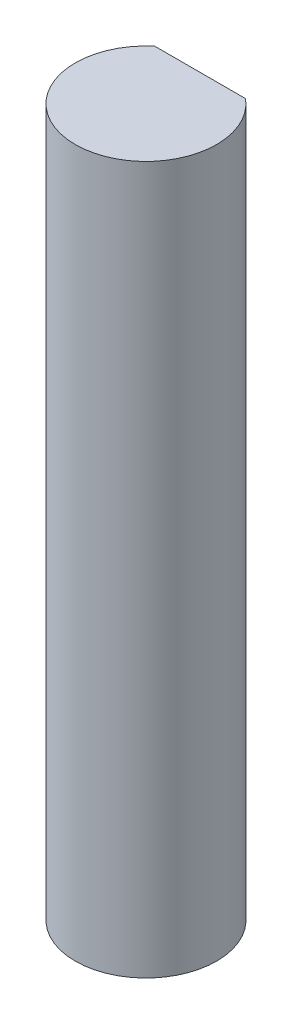
ISO-10303-21;
HEADER;
FILE_DESCRIPTION(('STEP AP214'),'2;1');
FILE_NAME('part.step','',(''),(''),'','','');
FILE_SCHEMA(('AUTOMOTIVE_DESIGN { 1 0 10303 214 1 1 1 1 }'));
ENDSEC;
DATA;
#1=APPLICATION_CONTEXT('core data for automotive mechanical design processes');
#2=APPLICATION_PROTOCOL_DEFINITION('international standard','automotive_design',2000,#1);
#3=PRODUCT_CONTEXT('',#1,'mechanical');
#4=PRODUCT('Part','Part','',(#3));
#5=PRODUCT_RELATED_PRODUCT_CATEGORY('part','',(#4));
#6=PRODUCT_DEFINITION_FORMATION('','',#4);
#7=PRODUCT_DEFINITION_CONTEXT('part definition',#1,'design');
#8=PRODUCT_DEFINITION('design','',#6,#7);
#9=PRODUCT_DEFINITION_SHAPE('','',#8);
#10=(LENGTH_UNIT() NAMED_UNIT(*) SI_UNIT(.MILLI.,.METRE.));
#11=(NAMED_UNIT(*) PLANE_ANGLE_UNIT() SI_UNIT($,.RADIAN.));
#12=(NAMED_UNIT(*) SI_UNIT($,.STERADIAN.) SOLID_ANGLE_UNIT());
#13=UNCERTAINTY_MEASURE_WITH_UNIT(LENGTH_MEASURE(1.E-05),#10,'distance_accuracy_value','');
#14=(GEOMETRIC_REPRESENTATION_CONTEXT(3) GLOBAL_UNCERTAINTY_ASSIGNED_CONTEXT((#13)) GLOBAL_UNIT_ASSIGNED_CONTEXT((#10,
#11,#12)) REPRESENTATION_CONTEXT('',''));
#15=CARTESIAN_POINT('',(0.,0.,0.));
#16=DIRECTION('',(0.,0.,1.));
#17=DIRECTION('',(1.,0.,0.));
#18=AXIS2_PLACEMENT_3D('',#15,#16,#17);
#19=CARTESIAN_POINT('',(0.,30.,0.));
#20=DIRECTION('',(0.,-1.,0.));
#21=DIRECTION('',(0.,0.,-1.));
#22=AXIS2_PLACEMENT_3D('',#19,#20,#21);
#23=CYLINDRICAL_SURFACE('',#22,3.);
#24=CARTESIAN_POINT('',(0.,30.,0.));
#25=DIRECTION('',(0.,1.,0.));
#26=DIRECTION('',(0.,0.,1.));
#27=AXIS2_PLACEMENT_3D('',#24,#25,#26);
#28=CIRCLE('',#27,3.);
#29=CARTESIAN_POINT('',(-1.92613602842582,30.,-2.3));
#30=VERTEX_POINT('',#29);
#31=CARTESIAN_POINT('',(1.92613602842582,30.,-2.3));
#32=VERTEX_POINT('',#31);
#33=EDGE_CURVE('E44',#30,#32,#28,.T.);
#34=ORIENTED_EDGE('',*,*,#33,.F.);
#35=DIRECTION('',(0.,-1.,0.));
#36=VECTOR('',#35,1.);
#37=CARTESIAN_POINT('',(-1.92613602842582,30.,-2.3));
#38=LINE('',#37,#36);
#39=CARTESIAN_POINT('',(-1.92613602842582,0.,-2.3));
#40=VERTEX_POINT('',#39);
#41=EDGE_CURVE('E58',#30,#40,#38,.T.);
#42=ORIENTED_EDGE('',*,*,#41,.T.);
#43=CARTESIAN_POINT('',(0.,0.,0.));
#44=DIRECTION('',(0.,1.,0.));
#45=DIRECTION('',(0.,0.,1.));
#46=AXIS2_PLACEMENT_3D('',#43,#44,#45);
#47=CIRCLE('',#46,3.);
#48=CARTESIAN_POINT('',(1.92613602842582,0.,-2.3));
#49=VERTEX_POINT('',#48);
#50=EDGE_CURVE('E66',#40,#49,#47,.T.);
#51=ORIENTED_EDGE('',*,*,#50,.T.);
#52=DIRECTION('',(0.,-1.,0.));
#53=VECTOR('',#52,1.);
#54=CARTESIAN_POINT('',(1.92613602842582,30.,-2.3));
#55=LINE('',#54,#53);
#56=EDGE_CURVE('E51',#49,#32,#55,.F.);
#57=ORIENTED_EDGE('',*,*,#56,.T.);
#58=EDGE_LOOP('',(#34,#42,#51,#57));
#59=FACE_BOUND('',#58,.T.);
#60=ADVANCED_FACE('F37',(#59),#23,.T.);
#61=CARTESIAN_POINT('',(0.,30.,0.));
#62=DIRECTION('',(0.,1.,0.));
#63=DIRECTION('',(0.,0.,1.));
#64=AXIS2_PLACEMENT_3D('',#61,#62,#63);
#65=PLANE('',#64);
#66=DIRECTION('',(1.,0.,0.));
#67=VECTOR('',#66,1.);
#68=CARTESIAN_POINT('',(-2.5,30.,-2.3));
#69=LINE('',#68,#67);
#70=EDGE_CURVE('E61',#30,#32,#69,.T.);
#71=ORIENTED_EDGE('',*,*,#70,.F.);
#72=ORIENTED_EDGE('',*,*,#33,.T.);
#73=EDGE_LOOP('',(#71,#72));
#74=FACE_BOUND('',#73,.T.);
#75=ADVANCED_FACE('F70',(#74),#65,.T.);
#76=CARTESIAN_POINT('',(0.,0.,0.));
#77=DIRECTION('',(0.,1.,0.));
#78=DIRECTION('',(0.,0.,1.));
#79=AXIS2_PLACEMENT_3D('',#76,#77,#78);
#80=PLANE('',#79);
#81=ORIENTED_EDGE('',*,*,#50,.F.);
#82=DIRECTION('',(1.,0.,0.));
#83=VECTOR('',#82,1.);
#84=CARTESIAN_POINT('',(0.,0.,-2.3));
#85=LINE('',#84,#83);
#86=EDGE_CURVE('E11',#40,#49,#85,.T.);
#87=ORIENTED_EDGE('',*,*,#86,.T.);
#88=EDGE_LOOP('',(#81,#87));
#89=FACE_BOUND('',#88,.T.);
#90=ADVANCED_FACE('F75',(#89),#80,.F.);
#91=CARTESIAN_POINT('',(-2.5,0.,-2.3));
#92=DIRECTION('',(0.,0.,1.));
#93=DIRECTION('',(1.,0.,0.));
#94=AXIS2_PLACEMENT_3D('',#91,#92,#93);
#95=PLANE('',#94);
#96=ORIENTED_EDGE('',*,*,#70,.T.);
#97=ORIENTED_EDGE('',*,*,#56,.F.);
#98=ORIENTED_EDGE('',*,*,#86,.F.);
#99=ORIENTED_EDGE('',*,*,#41,.F.);
#100=EDGE_LOOP('',(#96,#97,#98,#99));
#101=FACE_BOUND('',#100,.T.);
#102=ADVANCED_FACE('F60',(#101),#95,.F.);
#103=CLOSED_SHELL('',(#60,#75,#90,#102));
#104=MANIFOLD_SOLID_BREP('B2',#103);
#105=ADVANCED_BREP_SHAPE_REPRESENTATION('',(#18,#104),#14);
#106=SHAPE_DEFINITION_REPRESENTATION(#9,#105);
ENDSEC;
END-ISO-10303-21;
